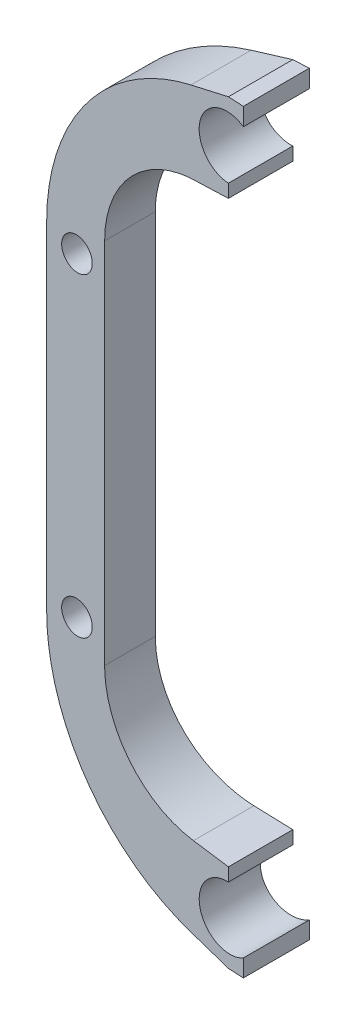
ISO-10303-21;
HEADER;
FILE_DESCRIPTION(('STEP AP214'),'2;1');
FILE_NAME('part.step','',(''),(''),'','','');
FILE_SCHEMA(('AUTOMOTIVE_DESIGN { 1 0 10303 214 1 1 1 1 }'));
ENDSEC;
DATA;
#1=APPLICATION_CONTEXT('core data for automotive mechanical design processes');
#2=APPLICATION_PROTOCOL_DEFINITION('international standard','automotive_design',2000,#1);
#3=PRODUCT_CONTEXT('',#1,'mechanical');
#4=PRODUCT('Part','Part','',(#3));
#5=PRODUCT_RELATED_PRODUCT_CATEGORY('part','',(#4));
#6=PRODUCT_DEFINITION_FORMATION('','',#4);
#7=PRODUCT_DEFINITION_CONTEXT('part definition',#1,'design');
#8=PRODUCT_DEFINITION('design','',#6,#7);
#9=PRODUCT_DEFINITION_SHAPE('','',#8);
#10=(LENGTH_UNIT() NAMED_UNIT(*) SI_UNIT(.MILLI.,.METRE.));
#11=(NAMED_UNIT(*) PLANE_ANGLE_UNIT() SI_UNIT($,.RADIAN.));
#12=(NAMED_UNIT(*) SI_UNIT($,.STERADIAN.) SOLID_ANGLE_UNIT());
#13=UNCERTAINTY_MEASURE_WITH_UNIT(LENGTH_MEASURE(1.E-05),#10,'distance_accuracy_value','');
#14=(GEOMETRIC_REPRESENTATION_CONTEXT(3) GLOBAL_UNCERTAINTY_ASSIGNED_CONTEXT((#13)) GLOBAL_UNIT_ASSIGNED_CONTEXT((#10,
#11,#12)) REPRESENTATION_CONTEXT('',''));
#15=CARTESIAN_POINT('',(0.,0.,0.));
#16=DIRECTION('',(0.,0.,1.));
#17=DIRECTION('',(1.,0.,0.));
#18=AXIS2_PLACEMENT_3D('',#15,#16,#17);
#19=CARTESIAN_POINT('',(7.0893845411661,19.7888100311249,4.5));
#20=DIRECTION('',(-1.,0.,0.));
#21=DIRECTION('',(0.,0.,1.));
#22=AXIS2_PLACEMENT_3D('',#19,#20,#21);
#23=PLANE('',#22);
#24=DIRECTION('',(0.,1.,0.));
#25=VECTOR('',#24,1.);
#26=CARTESIAN_POINT('',(7.0893845411661,19.7888100311249,0.));
#27=LINE('',#26,#25);
#28=CARTESIAN_POINT('',(7.0893845411661,18.578843696389,0.));
#29=VERTEX_POINT('',#28);
#30=CARTESIAN_POINT('',(7.0893845411661,19.7888100311249,0.));
#31=VERTEX_POINT('',#30);
#32=EDGE_CURVE('E179',#29,#31,#27,.T.);
#33=ORIENTED_EDGE('',*,*,#32,.T.);
#34=DIRECTION('',(0.,0.,-1.));
#35=VECTOR('',#34,1.);
#36=CARTESIAN_POINT('',(7.0893845411661,19.7888100311249,4.5));
#37=LINE('',#36,#35);
#38=CARTESIAN_POINT('',(7.0893845411661,19.7888100311249,4.5));
#39=VERTEX_POINT('',#38);
#40=EDGE_CURVE('E194',#39,#31,#37,.T.);
#41=ORIENTED_EDGE('',*,*,#40,.F.);
#42=DIRECTION('',(0.,1.,0.));
#43=VECTOR('',#42,1.);
#44=CARTESIAN_POINT('',(7.0893845411661,19.7888100311249,4.5));
#45=LINE('',#44,#43);
#46=CARTESIAN_POINT('',(7.0893845411661,18.578843696389,4.5));
#47=VERTEX_POINT('',#46);
#48=EDGE_CURVE('E203',#47,#39,#45,.T.);
#49=ORIENTED_EDGE('',*,*,#48,.F.);
#50=DIRECTION('',(0.,0.,-1.));
#51=VECTOR('',#50,1.);
#52=CARTESIAN_POINT('',(7.0893845411661,18.578843696389,4.5));
#53=LINE('',#52,#51);
#54=EDGE_CURVE('E196',#47,#29,#53,.T.);
#55=ORIENTED_EDGE('',*,*,#54,.T.);
#56=EDGE_LOOP('',(#33,#41,#49,#55));
#57=FACE_BOUND('',#56,.T.);
#58=ADVANCED_FACE('F35',(#57),#23,.F.);
#59=CARTESIAN_POINT('',(6.00809668454037,16.7840948757622,4.5));
#60=DIRECTION('',(0.,0.,-1.));
#61=DIRECTION('',(-1.,0.,0.));
#62=AXIS2_PLACEMENT_3D('',#59,#60,#61);
#63=CYLINDRICAL_SURFACE('',#62,2.09530588650616);
#64=DIRECTION('',(0.,0.,-1.));
#65=VECTOR('',#64,1.);
#66=CARTESIAN_POINT('',(6.01748699128146,14.6888100311249,4.5));
#67=LINE('',#66,#65);
#68=CARTESIAN_POINT('',(6.01748699128146,14.6888100311249,4.44382422979162));
#69=VERTEX_POINT('',#68);
#70=CARTESIAN_POINT('',(6.01748699128146,14.6888100311249,0.056175770208387));
#71=VERTEX_POINT('',#70);
#72=EDGE_CURVE('E205',#69,#71,#67,.T.);
#73=ORIENTED_EDGE('',*,*,#72,.T.);
#74=CARTESIAN_POINT('',(6.00809668454037,16.7840948757622,0.0566678953314737));
#75=DIRECTION('',(0.0523359562429444,0.,0.998629534754574));
#76=DIRECTION('',(0.998629534754574,0.,-0.0523359562429444));
#77=AXIS2_PLACEMENT_3D('',#74,#75,#76);
#78=ELLIPSE('',#77,2.09818137115393,2.09530588650616);
#79=EDGE_CURVE('E363',#71,#29,#78,.F.);
#80=ORIENTED_EDGE('',*,*,#79,.T.);
#81=ORIENTED_EDGE('',*,*,#54,.F.);
#82=CARTESIAN_POINT('',(6.00809668454037,16.7840948757622,4.44333210466853));
#83=DIRECTION('',(0.0523359562429369,0.,-0.998629534754574));
#84=DIRECTION('',(-0.998629534754574,0.,-0.0523359562429369));
#85=AXIS2_PLACEMENT_3D('',#82,#83,#84);
#86=ELLIPSE('',#85,2.09818137115392,2.09530588650616);
#87=EDGE_CURVE('E321',#47,#69,#86,.F.);
#88=ORIENTED_EDGE('',*,*,#87,.T.);
#89=EDGE_LOOP('',(#73,#80,#81,#88));
#90=FACE_BOUND('',#89,.T.);
#91=ADVANCED_FACE('F401',(#90),#63,.F.);
#92=CARTESIAN_POINT('',(6.01748699128146,13.7888100311249,4.5));
#93=DIRECTION('',(-1.,0.,0.));
#94=DIRECTION('',(0.,-1.,0.));
#95=AXIS2_PLACEMENT_3D('',#92,#93,#94);
#96=PLANE('',#95);
#97=DIRECTION('',(0.,0.,-1.));
#98=VECTOR('',#97,1.);
#99=CARTESIAN_POINT('',(6.01748699128146,13.7888100311249,4.5));
#100=LINE('',#99,#98);
#101=CARTESIAN_POINT('',(6.01748699128146,13.7888100311249,4.44382422979162));
#102=VERTEX_POINT('',#101);
#103=CARTESIAN_POINT('',(6.01748699128147,13.7888100311249,0.0561757702083869));
#104=VERTEX_POINT('',#103);
#105=EDGE_CURVE('E212',#102,#104,#100,.T.);
#106=ORIENTED_EDGE('',*,*,#105,.T.);
#107=DIRECTION('',(0.,1.,0.));
#108=VECTOR('',#107,1.);
#109=CARTESIAN_POINT('',(6.01748699128146,13.7888100311249,0.056175770208387));
#110=LINE('',#109,#108);
#111=EDGE_CURVE('E360',#104,#71,#110,.T.);
#112=ORIENTED_EDGE('',*,*,#111,.T.);
#113=ORIENTED_EDGE('',*,*,#72,.F.);
#114=DIRECTION('',(0.,-1.,0.));
#115=VECTOR('',#114,1.);
#116=CARTESIAN_POINT('',(6.01748699128146,13.7888100311249,4.44382422979162));
#117=LINE('',#116,#115);
#118=EDGE_CURVE('E318',#69,#102,#117,.T.);
#119=ORIENTED_EDGE('',*,*,#118,.T.);
#120=EDGE_LOOP('',(#106,#112,#113,#119));
#121=FACE_BOUND('',#120,.T.);
#122=ADVANCED_FACE('F399',(#121),#96,.F.);
#123=CARTESIAN_POINT('',(4.11252473120093,6.59540856611972,4.5));
#124=DIRECTION('',(0.,0.,1.));
#125=DIRECTION('',(1.,0.,0.));
#126=AXIS2_PLACEMENT_3D('',#123,#124,#125);
#127=CYLINDRICAL_SURFACE('',#126,7.);
#128=DIRECTION('',(0.,0.,-1.));
#129=VECTOR('',#128,1.);
#130=CARTESIAN_POINT('',(-2.88747526879907,6.59540856611972,4.5));
#131=LINE('',#130,#129);
#132=CARTESIAN_POINT('',(-2.88747526879907,6.59540856611972,0.522865066858505));
#133=VERTEX_POINT('',#132);
#134=CARTESIAN_POINT('',(-2.88747526879907,6.59540856611972,3.97713493314157));
#135=VERTEX_POINT('',#134);
#136=EDGE_CURVE('E238',#133,#135,#131,.F.);
#137=ORIENTED_EDGE('',*,*,#136,.F.);
#138=CARTESIAN_POINT('',(4.11252473120093,6.59540856611972,0.156010611877212));
#139=DIRECTION('',(0.0523359562429444,0.,0.998629534754574));
#140=DIRECTION('',(-0.998629534754574,0.,0.0523359562429444));
#141=AXIS2_PLACEMENT_3D('',#138,#139,#140);
#142=ELLIPSE('',#141,7.00960642198545,7.);
#143=CARTESIAN_POINT('',(3.50243453196729,13.5687714527619,0.187984084381395));
#144=VERTEX_POINT('',#143);
#145=EDGE_CURVE('E354',#133,#144,#142,.F.);
#146=ORIENTED_EDGE('',*,*,#145,.T.);
#147=DIRECTION('',(0.,0.,-1.));
#148=VECTOR('',#147,1.);
#149=CARTESIAN_POINT('',(3.50243453196729,13.5687714527619,0.));
#150=LINE('',#149,#148);
#151=CARTESIAN_POINT('',(3.50243453196729,13.5687714527619,4.31201591561863));
#152=VERTEX_POINT('',#151);
#153=EDGE_CURVE('E232',#152,#144,#150,.T.);
#154=ORIENTED_EDGE('',*,*,#153,.F.);
#155=CARTESIAN_POINT('',(4.11252473120093,6.59540856611972,4.34398938812281));
#156=DIRECTION('',(0.0523359562429369,0.,-0.998629534754574));
#157=DIRECTION('',(0.998629534754574,0.,0.0523359562429369));
#158=AXIS2_PLACEMENT_3D('',#155,#156,#157);
#159=ELLIPSE('',#158,7.00960642198544,7.);
#160=EDGE_CURVE('E312',#152,#135,#159,.F.);
#161=ORIENTED_EDGE('',*,*,#160,.T.);
#162=EDGE_LOOP('',(#137,#146,#154,#161));
#163=FACE_BOUND('',#162,.T.);
#164=ADVANCED_FACE('F393',(#163),#127,.F.);
#165=CARTESIAN_POINT('',(-2.88747526879907,13.0097267842417,4.5));
#166=DIRECTION('',(-0.0871557427476618,0.996194698091745,0.));
#167=DIRECTION('',(-0.996194698091745,-0.0871557427476618,0.));
#168=AXIS2_PLACEMENT_3D('',#165,#166,#167);
#169=PLANE('',#168);
#170=ORIENTED_EDGE('',*,*,#153,.T.);
#171=DIRECTION('',(0.994839797341938,0.0870372042918509,-0.0521373445210823));
#172=VECTOR('',#171,1.);
#173=CARTESIAN_POINT('',(-3.09376251756073,12.9916789885451,0.533676123460511));
#174=LINE('',#173,#172);
#175=EDGE_CURVE('E357',#144,#104,#174,.T.);
#176=ORIENTED_EDGE('',*,*,#175,.T.);
#177=ORIENTED_EDGE('',*,*,#105,.F.);
#178=DIRECTION('',(-0.994839797341938,-0.087037204291851,-0.0521373445210748));
#179=VECTOR('',#178,1.);
#180=CARTESIAN_POINT('',(-2.86035514390288,13.0120994877235,3.97855623866126));
#181=LINE('',#180,#179);
#182=EDGE_CURVE('E315',#102,#152,#181,.T.);
#183=ORIENTED_EDGE('',*,*,#182,.T.);
#184=EDGE_LOOP('',(#170,#176,#177,#183));
#185=FACE_BOUND('',#184,.T.);
#186=ADVANCED_FACE('F395',(#185),#169,.F.);
#187=CARTESIAN_POINT('',(4.11252473120093,-18.4777885038699,4.5));
#188=DIRECTION('',(0.,0.,1.));
#189=DIRECTION('',(1.,0.,0.));
#190=AXIS2_PLACEMENT_3D('',#187,#188,#189);
#191=CYLINDRICAL_SURFACE('',#190,7.);
#192=DIRECTION('',(0.,0.,-1.));
#193=VECTOR('',#192,1.);
#194=CARTESIAN_POINT('',(3.50243453196729,-25.4511513905121,4.5));
#195=LINE('',#194,#193);
#196=CARTESIAN_POINT('',(3.50243453196729,-25.4511513905121,0.187984084381396));
#197=VERTEX_POINT('',#196);
#198=CARTESIAN_POINT('',(3.50243453196729,-25.4511513905121,4.31201591561863));
#199=VERTEX_POINT('',#198);
#200=EDGE_CURVE('E241',#197,#199,#195,.F.);
#201=ORIENTED_EDGE('',*,*,#200,.F.);
#202=CARTESIAN_POINT('',(4.11252473120093,-18.4777885038699,0.156010611877212));
#203=DIRECTION('',(0.0523359562429444,0.,0.998629534754574));
#204=DIRECTION('',(-0.998629534754574,0.,0.0523359562429444));
#205=AXIS2_PLACEMENT_3D('',#202,#203,#204);
#206=ELLIPSE('',#205,7.00960642198545,7.);
#207=CARTESIAN_POINT('',(-2.88747526879907,-18.4777885038699,0.522865066858504));
#208=VERTEX_POINT('',#207);
#209=EDGE_CURVE('E339',#197,#208,#206,.F.);
#210=ORIENTED_EDGE('',*,*,#209,.T.);
#211=DIRECTION('',(0.,0.,-1.));
#212=VECTOR('',#211,1.);
#213=CARTESIAN_POINT('',(-2.88747526879907,-18.4777885038699,0.));
#214=LINE('',#213,#212);
#215=CARTESIAN_POINT('',(-2.88747526879907,-18.4777885038699,3.97713493314157));
#216=VERTEX_POINT('',#215);
#217=EDGE_CURVE('E235',#216,#208,#214,.T.);
#218=ORIENTED_EDGE('',*,*,#217,.F.);
#219=CARTESIAN_POINT('',(4.11252473120093,-18.4777885038699,4.34398938812281));
#220=DIRECTION('',(0.0523359562429369,0.,-0.998629534754574));
#221=DIRECTION('',(0.998629534754574,0.,0.0523359562429369));
#222=AXIS2_PLACEMENT_3D('',#219,#220,#221);
#223=ELLIPSE('',#222,7.00960642198544,7.);
#224=EDGE_CURVE('E297',#216,#199,#223,.F.);
#225=ORIENTED_EDGE('',*,*,#224,.T.);
#226=EDGE_LOOP('',(#201,#210,#218,#225));
#227=FACE_BOUND('',#226,.T.);
#228=ADVANCED_FACE('F387',(#227),#191,.F.);
#229=CARTESIAN_POINT('',(-2.88747526879907,-24.8921067219918,4.5));
#230=DIRECTION('',(-1.,0.,0.));
#231=DIRECTION('',(0.,-1.,0.));
#232=AXIS2_PLACEMENT_3D('',#229,#230,#231);
#233=PLANE('',#232);
#234=ORIENTED_EDGE('',*,*,#217,.T.);
#235=DIRECTION('',(0.,1.,0.));
#236=VECTOR('',#235,1.);
#237=CARTESIAN_POINT('',(-2.88747526879907,-24.8921067219918,0.522865066858505));
#238=LINE('',#237,#236);
#239=EDGE_CURVE('E342',#208,#133,#238,.T.);
#240=ORIENTED_EDGE('',*,*,#239,.T.);
#241=ORIENTED_EDGE('',*,*,#136,.T.);
#242=DIRECTION('',(0.,-1.,0.));
#243=VECTOR('',#242,1.);
#244=CARTESIAN_POINT('',(-2.88747526879907,-24.8921067219918,3.97713493314157));
#245=LINE('',#244,#243);
#246=EDGE_CURVE('E300',#135,#216,#245,.T.);
#247=ORIENTED_EDGE('',*,*,#246,.T.);
#248=EDGE_LOOP('',(#234,#240,#241,#247));
#249=FACE_BOUND('',#248,.T.);
#250=ADVANCED_FACE('F389',(#249),#233,.F.);
#251=CARTESIAN_POINT('',(6.01748699128147,-25.6711899688751,4.5));
#252=DIRECTION('',(-0.0871557427476625,-0.996194698091745,0.));
#253=DIRECTION('',(0.996194698091745,-0.0871557427476625,0.));
#254=AXIS2_PLACEMENT_3D('',#251,#252,#253);
#255=PLANE('',#254);
#256=DIRECTION('',(0.,0.,-1.));
#257=VECTOR('',#256,1.);
#258=CARTESIAN_POINT('',(6.01748699128147,-25.6711899688751,4.5));
#259=LINE('',#258,#257);
#260=CARTESIAN_POINT('',(6.01748699128147,-25.6711899688751,4.44382422979162));
#261=VERTEX_POINT('',#260);
#262=CARTESIAN_POINT('',(6.01748699128147,-25.6711899688751,0.0561757702083863));
#263=VERTEX_POINT('',#262);
#264=EDGE_CURVE('E215',#261,#263,#259,.T.);
#265=ORIENTED_EDGE('',*,*,#264,.T.);
#266=DIRECTION('',(-0.994839797341938,0.0870372042918516,0.0521373445210823));
#267=VECTOR('',#266,1.);
#268=CARTESIAN_POINT('',(5.78699335962085,-25.6510243890899,0.0682554295826027));
#269=LINE('',#268,#267);
#270=EDGE_CURVE('E345',#263,#197,#269,.T.);
#271=ORIENTED_EDGE('',*,*,#270,.T.);
#272=ORIENTED_EDGE('',*,*,#200,.T.);
#273=DIRECTION('',(0.994839797341938,-0.0870372042918516,0.0521373445210748));
#274=VECTOR('',#273,1.);
#275=CARTESIAN_POINT('',(6.0204007332787,-25.6714448882683,4.4439769325391));
#276=LINE('',#275,#274);
#277=EDGE_CURVE('E303',#199,#261,#276,.T.);
#278=ORIENTED_EDGE('',*,*,#277,.T.);
#279=EDGE_LOOP('',(#265,#271,#272,#278));
#280=FACE_BOUND('',#279,.T.);
#281=ADVANCED_FACE('F383',(#280),#255,.F.);
#282=CARTESIAN_POINT('',(6.01748699128147,-25.6711899688751,4.5));
#283=DIRECTION('',(-1.,0.,0.));
#284=DIRECTION('',(0.,-1.,0.));
#285=AXIS2_PLACEMENT_3D('',#282,#283,#284);
#286=PLANE('',#285);
#287=DIRECTION('',(0.,0.,-1.));
#288=VECTOR('',#287,1.);
#289=CARTESIAN_POINT('',(6.01748699128147,-26.5711899688751,4.5));
#290=LINE('',#289,#288);
#291=CARTESIAN_POINT('',(6.01748699128147,-26.5711899688751,4.44382422979162));
#292=VERTEX_POINT('',#291);
#293=CARTESIAN_POINT('',(6.01748699128147,-26.5711899688751,0.056175770208386));
#294=VERTEX_POINT('',#293);
#295=EDGE_CURVE('E218',#292,#294,#290,.T.);
#296=ORIENTED_EDGE('',*,*,#295,.T.);
#297=DIRECTION('',(0.,1.,0.));
#298=VECTOR('',#297,1.);
#299=CARTESIAN_POINT('',(6.01748699128147,-25.6711899688751,0.0561757702083861));
#300=LINE('',#299,#298);
#301=EDGE_CURVE('E348',#294,#263,#300,.T.);
#302=ORIENTED_EDGE('',*,*,#301,.T.);
#303=ORIENTED_EDGE('',*,*,#264,.F.);
#304=DIRECTION('',(0.,-1.,0.));
#305=VECTOR('',#304,1.);
#306=CARTESIAN_POINT('',(6.01748699128147,-25.6711899688751,4.44382422979162));
#307=LINE('',#306,#305);
#308=EDGE_CURVE('E306',#261,#292,#307,.T.);
#309=ORIENTED_EDGE('',*,*,#308,.T.);
#310=EDGE_LOOP('',(#296,#302,#303,#309));
#311=FACE_BOUND('',#310,.T.);
#312=ADVANCED_FACE('F381',(#311),#286,.F.);
#313=CARTESIAN_POINT('',(6.01988043906949,-28.6761785292322,4.5));
#314=DIRECTION('',(0.,0.,-1.));
#315=DIRECTION('',(-1.,0.,0.));
#316=AXIS2_PLACEMENT_3D('',#313,#314,#315);
#317=CYLINDRICAL_SURFACE('',#316,2.10498992107487);
#318=DIRECTION('',(0.,0.,-1.));
#319=VECTOR('',#318,1.);
#320=CARTESIAN_POINT('',(7.0893845411661,-30.4892266652246,4.5));
#321=LINE('',#320,#319);
#322=CARTESIAN_POINT('',(7.0893845411661,-30.4892266652246,4.5));
#323=VERTEX_POINT('',#322);
#324=CARTESIAN_POINT('',(7.0893845411661,-30.4892266652246,0.));
#325=VERTEX_POINT('',#324);
#326=EDGE_CURVE('E221',#323,#325,#321,.T.);
#327=ORIENTED_EDGE('',*,*,#326,.T.);
#328=CARTESIAN_POINT('',(6.01988043906949,-28.6761785292322,0.0560503349249864));
#329=DIRECTION('',(0.0523359562429444,0.,0.998629534754574));
#330=DIRECTION('',(0.998629534754574,0.,-0.0523359562429444));
#331=AXIS2_PLACEMENT_3D('',#328,#329,#330);
#332=ELLIPSE('',#331,2.10787869556872,2.10498992107487);
#333=EDGE_CURVE('E351',#325,#294,#332,.F.);
#334=ORIENTED_EDGE('',*,*,#333,.T.);
#335=ORIENTED_EDGE('',*,*,#295,.F.);
#336=CARTESIAN_POINT('',(6.01988043906949,-28.6761785292322,4.44394966507502));
#337=DIRECTION('',(0.0523359562429369,0.,-0.998629534754574));
#338=DIRECTION('',(-0.998629534754574,0.,-0.0523359562429369));
#339=AXIS2_PLACEMENT_3D('',#336,#337,#338);
#340=ELLIPSE('',#339,2.10787869556872,2.10498992107487);
#341=EDGE_CURVE('E309',#292,#323,#340,.F.);
#342=ORIENTED_EDGE('',*,*,#341,.T.);
#343=EDGE_LOOP('',(#327,#334,#335,#342));
#344=FACE_BOUND('',#343,.T.);
#345=ADVANCED_FACE('F377',(#344),#317,.F.);
#346=CARTESIAN_POINT('',(7.0893845411661,-31.6711899688753,4.5));
#347=DIRECTION('',(-1.,0.,0.));
#348=DIRECTION('',(0.,0.,1.));
#349=AXIS2_PLACEMENT_3D('',#346,#347,#348);
#350=PLANE('',#349);
#351=DIRECTION('',(0.,1.,0.));
#352=VECTOR('',#351,1.);
#353=CARTESIAN_POINT('',(7.0893845411661,-31.6711899688753,0.));
#354=LINE('',#353,#352);
#355=CARTESIAN_POINT('',(7.0893845411661,-31.6711899688753,0.));
#356=VERTEX_POINT('',#355);
#357=EDGE_CURVE('E198',#356,#325,#354,.T.);
#358=ORIENTED_EDGE('',*,*,#357,.T.);
#359=ORIENTED_EDGE('',*,*,#326,.F.);
#360=DIRECTION('',(0.,1.,0.));
#361=VECTOR('',#360,1.);
#362=CARTESIAN_POINT('',(7.0893845411661,-31.6711899688753,4.5));
#363=LINE('',#362,#361);
#364=CARTESIAN_POINT('',(7.0893845411661,-31.6711899688753,4.5));
#365=VERTEX_POINT('',#364);
#366=EDGE_CURVE('E197',#365,#323,#363,.T.);
#367=ORIENTED_EDGE('',*,*,#366,.F.);
#368=DIRECTION('',(0.,0.,-1.));
#369=VECTOR('',#368,1.);
#370=CARTESIAN_POINT('',(7.0893845411661,-31.6711899688753,4.5));
#371=LINE('',#370,#369);
#372=EDGE_CURVE('E224',#365,#356,#371,.T.);
#373=ORIENTED_EDGE('',*,*,#372,.T.);
#374=EDGE_LOOP('',(#358,#359,#367,#373));
#375=FACE_BOUND('',#374,.T.);
#376=ADVANCED_FACE('F372',(#375),#350,.F.);
#377=CARTESIAN_POINT('',(6.01748699128147,-31.6711899688751,4.5));
#378=DIRECTION('',(2.13624426003758E-13,1.,0.));
#379=DIRECTION('',(-1.,2.13624426003758E-13,0.));
#380=AXIS2_PLACEMENT_3D('',#377,#378,#379);
#381=PLANE('',#380);
#382=DIRECTION('',(0.,0.,-1.));
#383=VECTOR('',#382,1.);
#384=CARTESIAN_POINT('',(6.01748699128147,-31.6711899688751,4.5));
#385=LINE('',#384,#383);
#386=CARTESIAN_POINT('',(6.01748699128147,-31.6711899688753,4.44382422979162));
#387=VERTEX_POINT('',#386);
#388=CARTESIAN_POINT('',(6.01748699128147,-31.6711899688753,0.0561757702083869));
#389=VERTEX_POINT('',#388);
#390=EDGE_CURVE('E227',#387,#389,#385,.T.);
#391=ORIENTED_EDGE('',*,*,#390,.T.);
#392=DIRECTION('',(0.998629534754574,0.,-0.0523359562429444));
#393=VECTOR('',#392,1.);
#394=CARTESIAN_POINT('',(7.0893845411661,-31.6711899688753,0.));
#395=LINE('',#394,#393);
#396=EDGE_CURVE('E187',#389,#356,#395,.T.);
#397=ORIENTED_EDGE('',*,*,#396,.T.);
#398=ORIENTED_EDGE('',*,*,#372,.F.);
#399=DIRECTION('',(-0.998629534754574,0.,-0.0523359562429369));
#400=VECTOR('',#399,1.);
#401=CARTESIAN_POINT('',(7.0893845411661,-31.6711899688753,4.5));
#402=LINE('',#401,#400);
#403=EDGE_CURVE('E188',#365,#387,#402,.T.);
#404=ORIENTED_EDGE('',*,*,#403,.T.);
#405=EDGE_LOOP('',(#391,#397,#398,#404));
#406=FACE_BOUND('',#405,.T.);
#407=ADVANCED_FACE('F413',(#406),#381,.F.);
#408=CARTESIAN_POINT('',(6.94245060539237,-17.4251666965631,4.5));
#409=DIRECTION('',(0.,0.,-1.));
#410=DIRECTION('',(-1.,0.,0.));
#411=AXIS2_PLACEMENT_3D('',#408,#409,#410);
#412=CYLINDRICAL_SURFACE('',#411,14.);
#413=CARTESIAN_POINT('',(6.94245060539237,-17.4251666965631,0.00770048127521784));
#414=DIRECTION('',(0.0523359562429444,0.,0.998629534754574));
#415=DIRECTION('',(0.998629534754574,0.,-0.0523359562429444));
#416=AXIS2_PLACEMENT_3D('',#413,#414,#415);
#417=ELLIPSE('',#416,14.0192128439709,14.);
#418=CARTESIAN_POINT('',(3.31898397395703,-30.94812826461,0.197598320734948));
#419=VERTEX_POINT('',#418);
#420=CARTESIAN_POINT('',(-4.92877379935626,-24.8463546831391,0.629844989698743));
#421=VERTEX_POINT('',#420);
#422=EDGE_CURVE('E11',#419,#421,#417,.F.);
#423=ORIENTED_EDGE('',*,*,#422,.F.);
#424=DIRECTION('',(0.,0.,-1.));
#425=VECTOR('',#424,1.);
#426=CARTESIAN_POINT('',(3.31898397395703,-30.94812826461,4.5));
#427=LINE('',#426,#425);
#428=CARTESIAN_POINT('',(3.31898397395703,-30.94812826461,4.30240167926508));
#429=VERTEX_POINT('',#428);
#430=EDGE_CURVE('E253',#429,#419,#427,.T.);
#431=ORIENTED_EDGE('',*,*,#430,.F.);
#432=CARTESIAN_POINT('',(6.94245060539237,-17.4251666965631,4.49229951872478));
#433=DIRECTION('',(0.0523359562429369,0.,-0.998629534754574));
#434=DIRECTION('',(-0.998629534754574,0.,-0.0523359562429369));
#435=AXIS2_PLACEMENT_3D('',#432,#433,#434);
#436=ELLIPSE('',#435,14.0192128439709,14.);
#437=CARTESIAN_POINT('',(-7.05754939460763,-17.4251666965631,3.7585906087623));
#438=VERTEX_POINT('',#437);
#439=EDGE_CURVE('E256',#438,#429,#436,.F.);
#440=ORIENTED_EDGE('',*,*,#439,.F.);
#441=DIRECTION('',(0.,0.,-1.));
#442=VECTOR('',#441,1.);
#443=CARTESIAN_POINT('',(-7.05754939460763,-17.4251666965631,4.5));
#444=LINE('',#443,#442);
#445=CARTESIAN_POINT('',(-7.05754939460763,-17.4251666965631,0.629844989698743));
#446=VERTEX_POINT('',#445);
#447=EDGE_CURVE('E244',#446,#438,#444,.F.);
#448=ORIENTED_EDGE('',*,*,#447,.F.);
#449=CARTESIAN_POINT('',(6.94245060539237,-17.4251666965631,0.629844989698741));
#450=DIRECTION('',(0.,0.,1.));
#451=DIRECTION('',(1.,0.,0.));
#452=AXIS2_PLACEMENT_3D('',#449,#450,#451);
#453=CIRCLE('',#452,14.);
#454=EDGE_CURVE('E43',#421,#446,#453,.F.);
#455=ORIENTED_EDGE('',*,*,#454,.F.);
#456=EDGE_LOOP('',(#423,#431,#440,#448,#455));
#457=FACE_BOUND('',#456,.T.);
#458=ADVANCED_FACE('F37',(#457),#412,.T.);
#459=CARTESIAN_POINT('',(6.01748699128147,-31.6711899688751,4.5));
#460=DIRECTION('',(0.258819045102525,0.965925826289067,0.));
#461=DIRECTION('',(-0.965925826289067,0.258819045102525,0.));
#462=AXIS2_PLACEMENT_3D('',#459,#460,#461);
#463=PLANE('',#462);
#464=ORIENTED_EDGE('',*,*,#430,.T.);
#465=DIRECTION('',(0.964690564113554,-0.258488057600155,-0.0505572901604962));
#466=VECTOR('',#465,1.);
#467=CARTESIAN_POINT('',(5.80075217041124,-31.6131160486512,0.0675343608635033));
#468=LINE('',#467,#466);
#469=EDGE_CURVE('E334',#419,#389,#468,.T.);
#470=ORIENTED_EDGE('',*,*,#469,.T.);
#471=ORIENTED_EDGE('',*,*,#390,.F.);
#472=DIRECTION('',(-0.964690564113554,0.258488057600155,-0.0505572901604889));
#473=VECTOR('',#472,1.);
#474=CARTESIAN_POINT('',(6.02022680385365,-31.6719240994412,4.44396781728418));
#475=LINE('',#474,#473);
#476=EDGE_CURVE('E279',#387,#429,#475,.T.);
#477=ORIENTED_EDGE('',*,*,#476,.T.);
#478=EDGE_LOOP('',(#464,#470,#471,#477));
#479=FACE_BOUND('',#478,.T.);
#480=ADVANCED_FACE('F284',(#479),#463,.F.);
#481=CARTESIAN_POINT('',(6.94245060539237,5.54278675881298,4.5));
#482=DIRECTION('',(0.,0.,-1.));
#483=DIRECTION('',(-1.,0.,0.));
#484=AXIS2_PLACEMENT_3D('',#481,#482,#483);
#485=CYLINDRICAL_SURFACE('',#484,14.);
#486=CARTESIAN_POINT('',(6.94245060539237,5.54278675881298,0.00770048127521784));
#487=DIRECTION('',(0.0523359562429444,0.,0.998629534754574));
#488=DIRECTION('',(0.998629534754574,0.,-0.0523359562429444));
#489=AXIS2_PLACEMENT_3D('',#486,#487,#488);
#490=ELLIPSE('',#489,14.0192128439709,14.);
#491=CARTESIAN_POINT('',(-4.92877379935626,12.963974745389,0.629844989698743));
#492=VERTEX_POINT('',#491);
#493=CARTESIAN_POINT('',(3.31898397395713,19.0657483268599,0.197598320734943));
#494=VERTEX_POINT('',#493);
#495=EDGE_CURVE('E336',#492,#494,#490,.F.);
#496=ORIENTED_EDGE('',*,*,#495,.F.);
#497=CARTESIAN_POINT('',(6.94245060539237,5.54278675881298,0.629844989698741));
#498=DIRECTION('',(0.,0.,1.));
#499=DIRECTION('',(1.,0.,0.));
#500=AXIS2_PLACEMENT_3D('',#497,#498,#499);
#501=CIRCLE('',#500,14.);
#502=CARTESIAN_POINT('',(-7.05754939460763,5.54278675881298,0.629844989698743));
#503=VERTEX_POINT('',#502);
#504=EDGE_CURVE('E271',#503,#492,#501,.F.);
#505=ORIENTED_EDGE('',*,*,#504,.F.);
#506=DIRECTION('',(0.,0.,-1.));
#507=VECTOR('',#506,1.);
#508=CARTESIAN_POINT('',(-7.05754939460763,5.54278675881298,4.5));
#509=LINE('',#508,#507);
#510=CARTESIAN_POINT('',(-7.05754939460763,5.54278675881298,3.7585906087623));
#511=VERTEX_POINT('',#510);
#512=EDGE_CURVE('E247',#511,#503,#509,.T.);
#513=ORIENTED_EDGE('',*,*,#512,.F.);
#514=CARTESIAN_POINT('',(6.94245060539237,5.54278675881298,4.49229951872478));
#515=DIRECTION('',(0.0523359562429369,0.,-0.998629534754574));
#516=DIRECTION('',(-0.998629534754574,0.,-0.0523359562429369));
#517=AXIS2_PLACEMENT_3D('',#514,#515,#516);
#518=ELLIPSE('',#517,14.0192128439709,14.);
#519=CARTESIAN_POINT('',(3.31898397395713,19.0657483268599,4.30240167926508));
#520=VERTEX_POINT('',#519);
#521=EDGE_CURVE('E287',#520,#511,#518,.F.);
#522=ORIENTED_EDGE('',*,*,#521,.F.);
#523=DIRECTION('',(0.,0.,-1.));
#524=VECTOR('',#523,1.);
#525=CARTESIAN_POINT('',(3.31898397395713,19.0657483268599,4.5));
#526=LINE('',#525,#524);
#527=EDGE_CURVE('E250',#494,#520,#526,.F.);
#528=ORIENTED_EDGE('',*,*,#527,.F.);
#529=EDGE_LOOP('',(#496,#505,#513,#522,#528));
#530=FACE_BOUND('',#529,.T.);
#531=ADVANCED_FACE('F408',(#530),#485,.T.);
#532=CARTESIAN_POINT('',(-7.05754939460763,-28.1677445282685,4.5));
#533=DIRECTION('',(1.,0.,0.));
#534=DIRECTION('',(0.,0.,-1.));
#535=AXIS2_PLACEMENT_3D('',#532,#533,#534);
#536=PLANE('',#535);
#537=ORIENTED_EDGE('',*,*,#512,.T.);
#538=DIRECTION('',(0.,-1.,0.));
#539=VECTOR('',#538,1.);
#540=CARTESIAN_POINT('',(-7.05754939460763,-28.1677445282685,0.629844989698743));
#541=LINE('',#540,#539);
#542=EDGE_CURVE('E260',#503,#446,#541,.T.);
#543=ORIENTED_EDGE('',*,*,#542,.T.);
#544=ORIENTED_EDGE('',*,*,#447,.T.);
#545=DIRECTION('',(0.,1.,0.));
#546=VECTOR('',#545,1.);
#547=CARTESIAN_POINT('',(-7.05754939460763,-28.1677445282685,3.7585906087623));
#548=LINE('',#547,#546);
#549=EDGE_CURVE('E281',#438,#511,#548,.T.);
#550=ORIENTED_EDGE('',*,*,#549,.T.);
#551=EDGE_LOOP('',(#537,#543,#544,#550));
#552=FACE_BOUND('',#551,.T.);
#553=ADVANCED_FACE('F268',(#552),#536,.F.);
#554=CARTESIAN_POINT('',(6.01748699128146,19.7888100311249,4.5));
#555=DIRECTION('',(0.258819045102518,-0.965925826289069,0.));
#556=DIRECTION('',(0.965925826289069,0.258819045102518,0.));
#557=AXIS2_PLACEMENT_3D('',#554,#555,#556);
#558=PLANE('',#557);
#559=DIRECTION('',(0.,0.,-1.));
#560=VECTOR('',#559,1.);
#561=CARTESIAN_POINT('',(6.01748699128146,19.7888100311249,4.5));
#562=LINE('',#561,#560);
#563=CARTESIAN_POINT('',(6.01748699128146,19.7888100311249,4.44382422979162));
#564=VERTEX_POINT('',#563);
#565=CARTESIAN_POINT('',(6.01748699128146,19.7888100311249,0.0561757702083871));
#566=VERTEX_POINT('',#565);
#567=EDGE_CURVE('E230',#564,#566,#562,.T.);
#568=ORIENTED_EDGE('',*,*,#567,.T.);
#569=DIRECTION('',(-0.964690564113555,-0.258488057600148,0.0505572901604962));
#570=VECTOR('',#569,1.);
#571=CARTESIAN_POINT('',(5.80075217041123,19.730736110901,0.0675343608635042));
#572=LINE('',#571,#570);
#573=EDGE_CURVE('E182',#566,#494,#572,.T.);
#574=ORIENTED_EDGE('',*,*,#573,.T.);
#575=ORIENTED_EDGE('',*,*,#527,.T.);
#576=DIRECTION('',(0.964690564113556,0.258488057600148,0.050557290160489));
#577=VECTOR('',#576,1.);
#578=CARTESIAN_POINT('',(6.02022680385365,19.7895441616911,4.44396781728418));
#579=LINE('',#578,#577);
#580=EDGE_CURVE('E294',#520,#564,#579,.T.);
#581=ORIENTED_EDGE('',*,*,#580,.T.);
#582=EDGE_LOOP('',(#568,#574,#575,#581));
#583=FACE_BOUND('',#582,.T.);
#584=ADVANCED_FACE('F404',(#583),#558,.F.);
#585=CARTESIAN_POINT('',(6.01748699128146,19.7888100311249,4.5));
#586=DIRECTION('',(0.,-1.,0.));
#587=DIRECTION('',(1.,0.,0.));
#588=AXIS2_PLACEMENT_3D('',#585,#586,#587);
#589=PLANE('',#588);
#590=ORIENTED_EDGE('',*,*,#40,.T.);
#591=DIRECTION('',(0.998629534754574,0.,-0.0523359562429444));
#592=VECTOR('',#591,1.);
#593=CARTESIAN_POINT('',(7.0893845411661,19.7888100311249,0.));
#594=LINE('',#593,#592);
#595=EDGE_CURVE('E176',#566,#31,#594,.T.);
#596=ORIENTED_EDGE('',*,*,#595,.F.);
#597=ORIENTED_EDGE('',*,*,#567,.F.);
#598=DIRECTION('',(-0.998629534754574,0.,-0.0523359562429369));
#599=VECTOR('',#598,1.);
#600=CARTESIAN_POINT('',(7.0893845411661,19.7888100311249,4.5));
#601=LINE('',#600,#599);
#602=EDGE_CURVE('E202',#39,#564,#601,.T.);
#603=ORIENTED_EDGE('',*,*,#602,.F.);
#604=EDGE_LOOP('',(#590,#596,#597,#603));
#605=FACE_BOUND('',#604,.T.);
#606=ADVANCED_FACE('F201',(#605),#589,.F.);
#607=CARTESIAN_POINT('',(7.0893845411661,-31.6711899688753,4.5));
#608=DIRECTION('',(0.0523359562429369,0.,-0.998629534754574));
#609=DIRECTION('',(-0.998629534754574,0.,-0.0523359562429369));
#610=AXIS2_PLACEMENT_3D('',#607,#608,#609);
#611=PLANE('',#610);
#612=CARTESIAN_POINT('',(-4.8791524632151,-16.6711899688751,3.87275555433356));
#613=DIRECTION('',(0.0523359562429369,0.,-0.998629534754574));
#614=DIRECTION('',(-0.998629534754574,0.,-0.0523359562429369));
#615=AXIS2_PLACEMENT_3D('',#612,#613,#614);
#616=ELLIPSE('',#615,1.10150958059771,1.1);
#617=CARTESIAN_POINT('',(-5.9791524632151,-16.6711899688751,3.81510699712222));
#618=VERTEX_POINT('',#617);
#619=EDGE_CURVE('E272',#618,#618,#616,.T.);
#620=ORIENTED_EDGE('',*,*,#619,.T.);
#621=EDGE_LOOP('',(#620));
#622=FACE_BOUND('',#621,.T.);
#623=CARTESIAN_POINT('',(-4.8791524632151,4.78881003112493,3.87275555433356));
#624=DIRECTION('',(0.0523359562429369,0.,-0.998629534754574));
#625=DIRECTION('',(-0.998629534754574,0.,-0.0523359562429369));
#626=AXIS2_PLACEMENT_3D('',#623,#624,#625);
#627=ELLIPSE('',#626,1.10150958059771,1.1);
#628=CARTESIAN_POINT('',(-5.9791524632151,4.78881003112493,3.81510699712222));
#629=VERTEX_POINT('',#628);
#630=EDGE_CURVE('E324',#629,#629,#627,.T.);
#631=ORIENTED_EDGE('',*,*,#630,.T.);
#632=EDGE_LOOP('',(#631));
#633=FACE_BOUND('',#632,.T.);
#634=ORIENTED_EDGE('',*,*,#48,.T.);
#635=ORIENTED_EDGE('',*,*,#602,.T.);
#636=ORIENTED_EDGE('',*,*,#580,.F.);
#637=ORIENTED_EDGE('',*,*,#521,.T.);
#638=ORIENTED_EDGE('',*,*,#549,.F.);
#639=ORIENTED_EDGE('',*,*,#439,.T.);
#640=ORIENTED_EDGE('',*,*,#476,.F.);
#641=ORIENTED_EDGE('',*,*,#403,.F.);
#642=ORIENTED_EDGE('',*,*,#366,.T.);
#643=ORIENTED_EDGE('',*,*,#341,.F.);
#644=ORIENTED_EDGE('',*,*,#308,.F.);
#645=ORIENTED_EDGE('',*,*,#277,.F.);
#646=ORIENTED_EDGE('',*,*,#224,.F.);
#647=ORIENTED_EDGE('',*,*,#246,.F.);
#648=ORIENTED_EDGE('',*,*,#160,.F.);
#649=ORIENTED_EDGE('',*,*,#182,.F.);
#650=ORIENTED_EDGE('',*,*,#118,.F.);
#651=ORIENTED_EDGE('',*,*,#87,.F.);
#652=EDGE_LOOP('',(#634,#635,#636,#637,#638,#639,#640,#641,#642,#643,#644,#645,#646,#647,#648,
#649,#650,#651));
#653=FACE_BOUND('',#652,.T.);
#654=ADVANCED_FACE('F278',(#622,#633,#653),#611,.F.);
#655=CARTESIAN_POINT('',(7.0893845411661,-31.6711899688753,0.));
#656=DIRECTION('',(0.0523359562429444,0.,0.998629534754574));
#657=DIRECTION('',(0.998629534754574,0.,-0.0523359562429444));
#658=AXIS2_PLACEMENT_3D('',#655,#656,#657);
#659=PLANE('',#658);
#660=CARTESIAN_POINT('',(-4.8791524632151,-16.6711899688751,0.627244445666527));
#661=DIRECTION('',(0.0523359562429444,0.,0.998629534754574));
#662=DIRECTION('',(0.998629534754574,0.,-0.0523359562429444));
#663=AXIS2_PLACEMENT_3D('',#660,#661,#662);
#664=ELLIPSE('',#663,1.10150958059771,1.1);
#665=CARTESIAN_POINT('',(-4.92877379935626,-17.7700701820919,0.629844989698743));
#666=VERTEX_POINT('',#665);
#667=CARTESIAN_POINT('',(-4.92877379935626,-15.5723097556582,0.629844989698743));
#668=VERTEX_POINT('',#667);
#669=EDGE_CURVE('E367',#666,#668,#664,.T.);
#670=ORIENTED_EDGE('',*,*,#669,.T.);
#671=DIRECTION('',(0.,1.,0.));
#672=VECTOR('',#671,1.);
#673=CARTESIAN_POINT('',(-4.92877379935626,-31.6711899688753,0.629844989698743));
#674=LINE('',#673,#672);
#675=CARTESIAN_POINT('',(-4.92877379935626,3.68992981790805,0.629844989698743));
#676=VERTEX_POINT('',#675);
#677=EDGE_CURVE('E50',#668,#676,#674,.T.);
#678=ORIENTED_EDGE('',*,*,#677,.T.);
#679=CARTESIAN_POINT('',(-4.8791524632151,4.78881003112493,0.627244445666527));
#680=DIRECTION('',(0.0523359562429444,0.,0.998629534754574));
#681=DIRECTION('',(0.998629534754574,0.,-0.0523359562429444));
#682=AXIS2_PLACEMENT_3D('',#679,#680,#681);
#683=ELLIPSE('',#682,1.10150958059771,1.1);
#684=CARTESIAN_POINT('',(-4.92877379935626,5.88769024434181,0.629844989698743));
#685=VERTEX_POINT('',#684);
#686=EDGE_CURVE('E365',#676,#685,#683,.T.);
#687=ORIENTED_EDGE('',*,*,#686,.T.);
#688=EDGE_CURVE('E56',#685,#492,#674,.T.);
#689=ORIENTED_EDGE('',*,*,#688,.T.);
#690=ORIENTED_EDGE('',*,*,#495,.T.);
#691=ORIENTED_EDGE('',*,*,#573,.F.);
#692=ORIENTED_EDGE('',*,*,#595,.T.);
#693=ORIENTED_EDGE('',*,*,#32,.F.);
#694=ORIENTED_EDGE('',*,*,#79,.F.);
#695=ORIENTED_EDGE('',*,*,#111,.F.);
#696=ORIENTED_EDGE('',*,*,#175,.F.);
#697=ORIENTED_EDGE('',*,*,#145,.F.);
#698=ORIENTED_EDGE('',*,*,#239,.F.);
#699=ORIENTED_EDGE('',*,*,#209,.F.);
#700=ORIENTED_EDGE('',*,*,#270,.F.);
#701=ORIENTED_EDGE('',*,*,#301,.F.);
#702=ORIENTED_EDGE('',*,*,#333,.F.);
#703=ORIENTED_EDGE('',*,*,#357,.F.);
#704=ORIENTED_EDGE('',*,*,#396,.F.);
#705=ORIENTED_EDGE('',*,*,#469,.F.);
#706=ORIENTED_EDGE('',*,*,#422,.T.);
#707=EDGE_CURVE('E263',#421,#666,#674,.T.);
#708=ORIENTED_EDGE('',*,*,#707,.T.);
#709=EDGE_LOOP('',(#670,#678,#687,#689,#690,#691,#692,#693,#694,#695,#696,#697,#698,#699,#700,
#701,#702,#703,#704,#705,#706,#708));
#710=FACE_BOUND('',#709,.T.);
#711=ADVANCED_FACE('F178',(#710),#659,.F.);
#712=CARTESIAN_POINT('',(-4.92877379935626,-31.6711899688753,0.629844989698743));
#713=DIRECTION('',(0.,0.,1.));
#714=DIRECTION('',(1.,0.,0.));
#715=AXIS2_PLACEMENT_3D('',#712,#713,#714);
#716=PLANE('',#715);
#717=CARTESIAN_POINT('',(-4.8791524632151,-16.6711899688751,0.629844989698743));
#718=DIRECTION('',(0.,0.,1.));
#719=DIRECTION('',(1.,0.,0.));
#720=AXIS2_PLACEMENT_3D('',#717,#718,#719);
#721=CIRCLE('',#720,1.1);
#722=EDGE_CURVE('E332',#668,#666,#721,.T.);
#723=ORIENTED_EDGE('',*,*,#722,.T.);
#724=ORIENTED_EDGE('',*,*,#707,.F.);
#725=ORIENTED_EDGE('',*,*,#454,.T.);
#726=ORIENTED_EDGE('',*,*,#542,.F.);
#727=ORIENTED_EDGE('',*,*,#504,.T.);
#728=ORIENTED_EDGE('',*,*,#688,.F.);
#729=CARTESIAN_POINT('',(-4.8791524632151,4.78881003112493,0.629844989698743));
#730=DIRECTION('',(0.,0.,1.));
#731=DIRECTION('',(1.,0.,0.));
#732=AXIS2_PLACEMENT_3D('',#729,#730,#731);
#733=CIRCLE('',#732,1.1);
#734=EDGE_CURVE('E330',#685,#676,#733,.T.);
#735=ORIENTED_EDGE('',*,*,#734,.T.);
#736=ORIENTED_EDGE('',*,*,#677,.F.);
#737=EDGE_LOOP('',(#723,#724,#725,#726,#727,#728,#735,#736));
#738=FACE_BOUND('',#737,.T.);
#739=ADVANCED_FACE('F259',(#738),#716,.F.);
#740=CARTESIAN_POINT('',(-4.8791524632151,4.78881003112493,4.5));
#741=DIRECTION('',(0.,0.,-1.));
#742=DIRECTION('',(-1.,0.,0.));
#743=AXIS2_PLACEMENT_3D('',#740,#741,#742);
#744=CYLINDRICAL_SURFACE('',#743,1.1);
#745=ORIENTED_EDGE('',*,*,#686,.F.);
#746=ORIENTED_EDGE('',*,*,#734,.F.);
#747=EDGE_LOOP('',(#745,#746));
#748=FACE_BOUND('',#747,.T.);
#749=ORIENTED_EDGE('',*,*,#630,.F.);
#750=EDGE_LOOP('',(#749));
#751=FACE_BOUND('',#750,.T.);
#752=ADVANCED_FACE('F420',(#748,#751),#744,.F.);
#753=CARTESIAN_POINT('',(-4.8791524632151,-16.6711899688751,4.5));
#754=DIRECTION('',(0.,0.,-1.));
#755=DIRECTION('',(-1.,0.,0.));
#756=AXIS2_PLACEMENT_3D('',#753,#754,#755);
#757=CYLINDRICAL_SURFACE('',#756,1.1);
#758=ORIENTED_EDGE('',*,*,#669,.F.);
#759=ORIENTED_EDGE('',*,*,#722,.F.);
#760=EDGE_LOOP('',(#758,#759));
#761=FACE_BOUND('',#760,.T.);
#762=ORIENTED_EDGE('',*,*,#619,.F.);
#763=EDGE_LOOP('',(#762));
#764=FACE_BOUND('',#763,.T.);
#765=ADVANCED_FACE('F417',(#761,#764),#757,.F.);
#766=CLOSED_SHELL('',(#58,#91,#122,#164,#186,#228,#250,#281,#312,#345,#376,#407,#458,#480,#531,
#553,#584,#606,#654,#711,#739,#752,#765));
#767=MANIFOLD_SOLID_BREP('B2',#766);
#768=ADVANCED_BREP_SHAPE_REPRESENTATION('',(#18,#767),#14);
#769=SHAPE_DEFINITION_REPRESENTATION(#9,#768);
ENDSEC;
END-ISO-10303-21;
